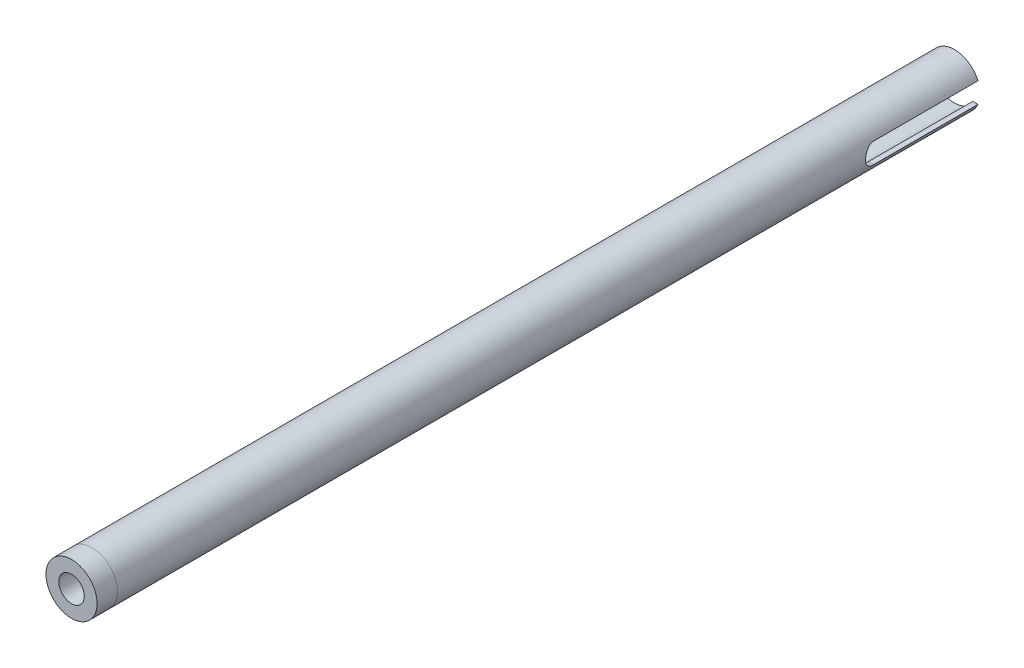
ISO-10303-21;
HEADER;
FILE_DESCRIPTION(('STEP AP214'),'2;1');
FILE_NAME('part.step','',(''),(''),'','','');
FILE_SCHEMA(('AUTOMOTIVE_DESIGN { 1 0 10303 214 1 1 1 1 }'));
ENDSEC;
DATA;
#1=APPLICATION_CONTEXT('core data for automotive mechanical design processes');
#2=APPLICATION_PROTOCOL_DEFINITION('international standard','automotive_design',2000,#1);
#3=PRODUCT_CONTEXT('',#1,'mechanical');
#4=PRODUCT('Part','Part','',(#3));
#5=PRODUCT_RELATED_PRODUCT_CATEGORY('part','',(#4));
#6=PRODUCT_DEFINITION_FORMATION('','',#4);
#7=PRODUCT_DEFINITION_CONTEXT('part definition',#1,'design');
#8=PRODUCT_DEFINITION('design','',#6,#7);
#9=PRODUCT_DEFINITION_SHAPE('','',#8);
#10=(LENGTH_UNIT() NAMED_UNIT(*) SI_UNIT(.MILLI.,.METRE.));
#11=(NAMED_UNIT(*) PLANE_ANGLE_UNIT() SI_UNIT($,.RADIAN.));
#12=(NAMED_UNIT(*) SI_UNIT($,.STERADIAN.) SOLID_ANGLE_UNIT());
#13=UNCERTAINTY_MEASURE_WITH_UNIT(LENGTH_MEASURE(1.E-05),#10,'distance_accuracy_value','');
#14=(GEOMETRIC_REPRESENTATION_CONTEXT(3) GLOBAL_UNCERTAINTY_ASSIGNED_CONTEXT((#13)) GLOBAL_UNIT_ASSIGNED_CONTEXT((#10,
#11,#12)) REPRESENTATION_CONTEXT('',''));
#15=CARTESIAN_POINT('',(0.,0.,0.));
#16=DIRECTION('',(0.,0.,1.));
#17=DIRECTION('',(1.,0.,0.));
#18=AXIS2_PLACEMENT_3D('',#15,#16,#17);
#19=CARTESIAN_POINT('',(0.,0.,-274.208037482782));
#20=DIRECTION('',(0.,0.,1.));
#21=DIRECTION('',(1.,0.,0.));
#22=AXIS2_PLACEMENT_3D('',#19,#20,#21);
#23=CYLINDRICAL_SURFACE('',#22,7.9375);
#24=CARTESIAN_POINT('',(0.,0.,-6.35));
#25=DIRECTION('',(0.,0.,1.));
#26=DIRECTION('',(1.,0.,0.));
#27=AXIS2_PLACEMENT_3D('',#24,#25,#26);
#28=CIRCLE('',#27,7.9375);
#29=CARTESIAN_POINT('',(7.9375,0.,-6.35));
#30=VERTEX_POINT('',#29);
#31=EDGE_CURVE('E167',#30,#30,#28,.T.);
#32=ORIENTED_EDGE('',*,*,#31,.F.);
#33=EDGE_LOOP('',(#32));
#34=FACE_BOUND('',#33,.T.);
#35=CARTESIAN_POINT('',(-7.2748389157424,3.175,-241.823037482782));
#36=CARTESIAN_POINT('',(-7.27482137043434,3.17501267173453,-241.737617367299));
#37=CARTESIAN_POINT('',(-7.27634297592672,3.17155313247793,-241.652206837736));
#38=CARTESIAN_POINT('',(-7.28233338484875,3.15778866907725,-241.482074833408));
#39=CARTESIAN_POINT('',(-7.28680106535325,3.14748635311323,-241.397353108549));
#40=CARTESIAN_POINT('',(-7.29852916312671,3.12019002880163,-241.229539408741));
#41=CARTESIAN_POINT('',(-7.30577831906487,3.10322299732752,-241.146442263981));
#42=CARTESIAN_POINT('',(-7.32282161153745,3.06278779397034,-240.982131161956));
#43=CARTESIAN_POINT('',(-7.33261590324725,3.03931922568673,-240.900917319843));
#44=CARTESIAN_POINT('',(-7.36535331460444,2.9595292434296,-240.66109249726));
#45=CARTESIAN_POINT('',(-7.3916759567784,2.89376893609236,-240.505967568456));
#46=CARTESIAN_POINT('',(-7.45033259991548,2.73920602658921,-240.208880141745));
#47=CARTESIAN_POINT('',(-7.48267254395243,2.65038060922871,-240.066930866527));
#48=CARTESIAN_POINT('',(-7.55175295441386,2.44684429809695,-239.792210097007));
#49=CARTESIAN_POINT('',(-7.58863404630154,2.33103943595689,-239.660282712496));
#50=CARTESIAN_POINT('',(-7.66147718953598,2.07914562663536,-239.417119828864));
#51=CARTESIAN_POINT('',(-7.69743902899202,1.94305205135847,-239.305889063936));
#52=CARTESIAN_POINT('',(-7.76611692840652,1.64778282664418,-239.102967864441));
#53=CARTESIAN_POINT('',(-7.79864638434713,1.48790317306355,-239.012233453037));
#54=CARTESIAN_POINT('',(-7.85502980346525,1.15369615984562,-238.85937589962));
#55=CARTESIAN_POINT('',(-7.87889360585224,0.979385463602713,-238.797220287002));
#56=CARTESIAN_POINT('',(-7.91022225039827,0.670405323433344,-238.716708643346));
#57=CARTESIAN_POINT('',(-7.92038443902171,0.537888188660429,-238.691030719937));
#58=CARTESIAN_POINT('',(-7.93061686811603,0.337231082382099,-238.665275636855));
#59=CARTESIAN_POINT('',(-7.93319257341971,0.269991647180292,-238.658817539574));
#60=CARTESIAN_POINT('',(-7.93663621925193,0.135173873369592,-238.650196521823));
#61=CARTESIAN_POINT('',(-7.93750363389236,0.067595436817584,-238.648034924004));
#62=CARTESIAN_POINT('',(-7.9375,0.,-238.648037482782));
#63=B_SPLINE_CURVE_WITH_KNOTS('',3,(#35,#36,#37,#38,#39,#40,#41,#42,#43,#44,#45,#46,#47,#48,#49,
#50,#51,#52,#53,#54,#55,#56,#57,#58,#59,#60,#61,#62),.UNSPECIFIED.,.F.,.F.,(4,2,2,2,2,2,2,2,2,2,
2,2,2,4),(0.,0.25616079739664,0.512224013007086,0.767261264672294,1.02231406945474,
1.53142416248601,2.041039780479,2.57679273649399,3.11266809162684,3.66991136029743,
4.22651992730647,4.63134321412667,4.83399375866621,5.03670667834028),.UNSPECIFIED.);
#64=CARTESIAN_POINT('',(-7.2748389157424,3.175,-241.823037482782));
#65=VERTEX_POINT('',#64);
#66=CARTESIAN_POINT('',(-7.9375,0.,-238.648037482782));
#67=VERTEX_POINT('',#66);
#68=EDGE_CURVE('E194',#65,#67,#63,.T.);
#69=ORIENTED_EDGE('',*,*,#68,.T.);
#70=CARTESIAN_POINT('',(-7.9375,0.,-238.648037482782));
#71=CARTESIAN_POINT('',(-7.93751279435796,-0.0856973243893161,-238.648025452613));
#72=CARTESIAN_POINT('',(-7.93611246860092,-0.171386675169289,-238.651506820085));
#73=CARTESIAN_POINT('',(-7.93058107051394,-0.342092796869087,-238.665362915419));
#74=CARTESIAN_POINT('',(-7.92645080745519,-0.427109759557717,-238.675735600402));
#75=CARTESIAN_POINT('',(-7.91557399086504,-0.595570690948318,-238.70323279447));
#76=CARTESIAN_POINT('',(-7.90883664469869,-0.679019123580009,-238.720333545743));
#77=CARTESIAN_POINT('',(-7.89293284658536,-0.844038966454647,-238.761100793216));
#78=CARTESIAN_POINT('',(-7.88376629739099,-0.925610301410308,-238.784767552273));
#79=CARTESIAN_POINT('',(-7.8529700783248,-1.16656173687589,-238.865275207971));
#80=CARTESIAN_POINT('',(-7.82802544143957,-1.32244720282991,-238.931667840849));
#81=CARTESIAN_POINT('',(-7.77174407779742,-1.6208190257289,-239.087713244842));
#82=CARTESIAN_POINT('',(-7.74040257287306,-1.76329524966532,-239.177383416905));
#83=CARTESIAN_POINT('',(-7.67287736621953,-2.03755465224645,-239.38183702442));
#84=CARTESIAN_POINT('',(-7.63654472176442,-2.16862853615059,-239.497523881151));
#85=CARTESIAN_POINT('',(-7.56380976030912,-2.41011022612819,-239.748817982861));
#86=CARTESIAN_POINT('',(-7.52740741976911,-2.52050895891189,-239.884433927343));
#87=CARTESIAN_POINT('',(-7.45683282624283,-2.72240939900244,-240.179132422209));
#88=CARTESIAN_POINT('',(-7.42283467350379,-2.81283701743192,-240.338996412125));
#89=CARTESIAN_POINT('',(-7.36333622196319,-2.9651189416839,-240.673122376921));
#90=CARTESIAN_POINT('',(-7.33782422493328,-3.02701262758154,-240.84736411468));
#91=CARTESIAN_POINT('',(-7.30424985403508,-3.10695047193343,-241.155667839331));
#92=CARTESIAN_POINT('',(-7.29331360019112,-3.13238569878911,-241.287526600218));
#93=CARTESIAN_POINT('',(-7.2822797767429,-3.15790858319002,-241.487243481911));
#94=CARTESIAN_POINT('',(-7.27949685702346,-3.16431127275807,-241.554191772671));
#95=CARTESIAN_POINT('',(-7.27577355567174,-3.17285909036155,-241.688433330537));
#96=CARTESIAN_POINT('',(-7.27483380475762,-3.17500276099679,-241.755726707835));
#97=CARTESIAN_POINT('',(-7.2748389157424,-3.175,-241.823037482782));
#98=B_SPLINE_CURVE_WITH_KNOTS('',3,(#70,#71,#72,#73,#74,#75,#76,#77,#78,#79,#80,#81,#82,#83,#84,
#85,#86,#87,#88,#89,#90,#91,#92,#93,#94,#95,#96,#97),.UNSPECIFIED.,.F.,.F.,(4,2,2,2,2,2,2,2,2,2,
2,2,2,4),(0.,0.256996432008006,0.513916713336977,0.769937797705395,1.02596913282158,
1.53722547809955,2.04886511530061,2.58219314099272,3.115754672018,3.67332953074265,
4.23013255190376,4.63306130520187,4.83485003827449,5.03670780985621),.UNSPECIFIED.);
#99=CARTESIAN_POINT('',(-7.2748389157424,-3.175,-241.823037482782));
#100=VERTEX_POINT('',#99);
#101=EDGE_CURVE('E146',#67,#100,#98,.T.);
#102=ORIENTED_EDGE('',*,*,#101,.T.);
#103=DIRECTION('',(0.,0.,-1.));
#104=VECTOR('',#103,1.);
#105=CARTESIAN_POINT('',(-7.2748389157424,-3.175,-238.648037482782));
#106=LINE('',#105,#104);
#107=CARTESIAN_POINT('',(-7.2748389157424,-3.175,-274.208037482782));
#108=VERTEX_POINT('',#107);
#109=EDGE_CURVE('E141',#100,#108,#106,.T.);
#110=ORIENTED_EDGE('',*,*,#109,.T.);
#111=CARTESIAN_POINT('',(0.,0.,-274.208037482782));
#112=DIRECTION('',(0.,0.,1.));
#113=DIRECTION('',(1.,0.,0.));
#114=AXIS2_PLACEMENT_3D('',#111,#112,#113);
#115=CIRCLE('',#114,7.9375);
#116=CARTESIAN_POINT('',(7.2748389157424,-3.175,-274.208037482782));
#117=VERTEX_POINT('',#116);
#118=EDGE_CURVE('E144',#108,#117,#115,.T.);
#119=ORIENTED_EDGE('',*,*,#118,.T.);
#120=DIRECTION('',(0.,0.,-1.));
#121=VECTOR('',#120,1.);
#122=CARTESIAN_POINT('',(7.2748389157424,-3.175,-238.648037482782));
#123=LINE('',#122,#121);
#124=CARTESIAN_POINT('',(7.2748389157424,-3.175,-241.823037482782));
#125=VERTEX_POINT('',#124);
#126=EDGE_CURVE('E427',#125,#117,#123,.T.);
#127=ORIENTED_EDGE('',*,*,#126,.F.);
#128=CARTESIAN_POINT('',(7.2748389157424,-3.175,-241.823037482782));
#129=CARTESIAN_POINT('',(7.27482137043434,-3.17501267173453,-241.737617367299));
#130=CARTESIAN_POINT('',(7.27634297592672,-3.17155313247793,-241.652206837736));
#131=CARTESIAN_POINT('',(7.28233338484875,-3.15778866907725,-241.482074833408));
#132=CARTESIAN_POINT('',(7.28680106535325,-3.14748635311323,-241.397353108549));
#133=CARTESIAN_POINT('',(7.29852916312671,-3.12019002880163,-241.229539408741));
#134=CARTESIAN_POINT('',(7.30577831906487,-3.10322299732752,-241.146442263981));
#135=CARTESIAN_POINT('',(7.32282161153745,-3.06278779397034,-240.982131161956));
#136=CARTESIAN_POINT('',(7.33261590324725,-3.03931922568673,-240.900917319843));
#137=CARTESIAN_POINT('',(7.36535331460444,-2.9595292434296,-240.66109249726));
#138=CARTESIAN_POINT('',(7.3916759567784,-2.89376893609236,-240.505967568456));
#139=CARTESIAN_POINT('',(7.45033259991548,-2.73920602658921,-240.208880141745));
#140=CARTESIAN_POINT('',(7.48267254395243,-2.65038060922871,-240.066930866527));
#141=CARTESIAN_POINT('',(7.55175295441386,-2.44684429809695,-239.792210097007));
#142=CARTESIAN_POINT('',(7.58863404630154,-2.33103943595689,-239.660282712496));
#143=CARTESIAN_POINT('',(7.66147718953598,-2.07914562663536,-239.417119828864));
#144=CARTESIAN_POINT('',(7.69743902899202,-1.94305205135847,-239.305889063936));
#145=CARTESIAN_POINT('',(7.76611692840652,-1.64778282664418,-239.102967864441));
#146=CARTESIAN_POINT('',(7.79864638434713,-1.48790317306355,-239.012233453037));
#147=CARTESIAN_POINT('',(7.85502980346525,-1.15369615984562,-238.85937589962));
#148=CARTESIAN_POINT('',(7.87889360585224,-0.979385463602713,-238.797220287002));
#149=CARTESIAN_POINT('',(7.91022225039827,-0.670405323433344,-238.716708643346));
#150=CARTESIAN_POINT('',(7.92038443902171,-0.537888188660429,-238.691030719937));
#151=CARTESIAN_POINT('',(7.93061686811603,-0.337231082382099,-238.665275636855));
#152=CARTESIAN_POINT('',(7.93319257341971,-0.269991647180292,-238.658817539574));
#153=CARTESIAN_POINT('',(7.93663621925193,-0.135173873369592,-238.650196521823));
#154=CARTESIAN_POINT('',(7.93750363389236,-0.067595436817584,-238.648034924004));
#155=CARTESIAN_POINT('',(7.9375,0.,-238.648037482782));
#156=B_SPLINE_CURVE_WITH_KNOTS('',3,(#128,#129,#130,#131,#132,#133,#134,#135,#136,#137,#138,
#139,#140,#141,#142,#143,#144,#145,#146,#147,#148,#149,#150,#151,#152,#153,#154,#155),
.UNSPECIFIED.,.F.,.F.,(4,2,2,2,2,2,2,2,2,2,2,2,2,4),(0.,0.25616079739664,0.512224013007086,
0.767261264672294,1.02231406945474,1.53142416248601,2.041039780479,2.57679273649399,
3.11266809162684,3.66991136029743,4.22651992730647,4.63134321412667,4.83399375866621,
5.03670667834028),.UNSPECIFIED.);
#157=CARTESIAN_POINT('',(7.9375,0.,-238.648037482782));
#158=VERTEX_POINT('',#157);
#159=EDGE_CURVE('E87',#125,#158,#156,.T.);
#160=ORIENTED_EDGE('',*,*,#159,.T.);
#161=CARTESIAN_POINT('',(7.9375,0.,-238.648037482782));
#162=CARTESIAN_POINT('',(7.93751279435796,0.0856973243893161,-238.648025452613));
#163=CARTESIAN_POINT('',(7.93611246860092,0.171386675169289,-238.651506820085));
#164=CARTESIAN_POINT('',(7.93058107051394,0.342092796869087,-238.665362915419));
#165=CARTESIAN_POINT('',(7.92645080745519,0.427109759557717,-238.675735600402));
#166=CARTESIAN_POINT('',(7.91557399086504,0.595570690948318,-238.70323279447));
#167=CARTESIAN_POINT('',(7.90883664469869,0.679019123580009,-238.720333545743));
#168=CARTESIAN_POINT('',(7.89293284658536,0.844038966454647,-238.761100793216));
#169=CARTESIAN_POINT('',(7.88376629739099,0.925610301410308,-238.784767552273));
#170=CARTESIAN_POINT('',(7.8529700783248,1.16656173687589,-238.865275207971));
#171=CARTESIAN_POINT('',(7.82802544143957,1.32244720282991,-238.931667840849));
#172=CARTESIAN_POINT('',(7.77174407779742,1.6208190257289,-239.087713244842));
#173=CARTESIAN_POINT('',(7.74040257287306,1.76329524966532,-239.177383416905));
#174=CARTESIAN_POINT('',(7.67287736621953,2.03755465224645,-239.38183702442));
#175=CARTESIAN_POINT('',(7.63654472176442,2.16862853615059,-239.497523881151));
#176=CARTESIAN_POINT('',(7.56380976030912,2.41011022612819,-239.748817982861));
#177=CARTESIAN_POINT('',(7.52740741976911,2.52050895891189,-239.884433927343));
#178=CARTESIAN_POINT('',(7.45683282624283,2.72240939900244,-240.179132422209));
#179=CARTESIAN_POINT('',(7.42283467350379,2.81283701743192,-240.338996412125));
#180=CARTESIAN_POINT('',(7.36333622196319,2.9651189416839,-240.673122376921));
#181=CARTESIAN_POINT('',(7.33782422493328,3.02701262758154,-240.84736411468));
#182=CARTESIAN_POINT('',(7.30424985403508,3.10695047193343,-241.155667839331));
#183=CARTESIAN_POINT('',(7.29331360019112,3.13238569878911,-241.287526600218));
#184=CARTESIAN_POINT('',(7.2822797767429,3.15790858319002,-241.487243481911));
#185=CARTESIAN_POINT('',(7.27949685702346,3.16431127275807,-241.554191772671));
#186=CARTESIAN_POINT('',(7.27577355567174,3.17285909036155,-241.688433330537));
#187=CARTESIAN_POINT('',(7.27483380475762,3.17500276099679,-241.755726707835));
#188=CARTESIAN_POINT('',(7.2748389157424,3.175,-241.823037482782));
#189=B_SPLINE_CURVE_WITH_KNOTS('',3,(#161,#162,#163,#164,#165,#166,#167,#168,#169,#170,#171,
#172,#173,#174,#175,#176,#177,#178,#179,#180,#181,#182,#183,#184,#185,#186,#187,#188),
.UNSPECIFIED.,.F.,.F.,(4,2,2,2,2,2,2,2,2,2,2,2,2,4),(0.,0.256996432008006,0.513916713336977,
0.769937797705395,1.02596913282158,1.53722547809955,2.04886511530061,2.58219314099272,
3.115754672018,3.67332953074265,4.23013255190376,4.63306130520187,4.83485003827449,
5.03670780985621),.UNSPECIFIED.);
#190=CARTESIAN_POINT('',(7.2748389157424,3.175,-241.823037482782));
#191=VERTEX_POINT('',#190);
#192=EDGE_CURVE('E73',#158,#191,#189,.T.);
#193=ORIENTED_EDGE('',*,*,#192,.T.);
#194=DIRECTION('',(0.,0.,-1.));
#195=VECTOR('',#194,1.);
#196=CARTESIAN_POINT('',(7.2748389157424,3.175,-238.648037482782));
#197=LINE('',#196,#195);
#198=CARTESIAN_POINT('',(7.2748389157424,3.175,-274.208037482782));
#199=VERTEX_POINT('',#198);
#200=EDGE_CURVE('E160',#191,#199,#197,.T.);
#201=ORIENTED_EDGE('',*,*,#200,.T.);
#202=CARTESIAN_POINT('',(-7.2748389157424,3.175,-274.208037482782));
#203=VERTEX_POINT('',#202);
#204=EDGE_CURVE('E166',#199,#203,#115,.T.);
#205=ORIENTED_EDGE('',*,*,#204,.T.);
#206=DIRECTION('',(0.,0.,-1.));
#207=VECTOR('',#206,1.);
#208=CARTESIAN_POINT('',(-7.2748389157424,3.175,-238.648037482782));
#209=LINE('',#208,#207);
#210=EDGE_CURVE('E420',#65,#203,#209,.T.);
#211=ORIENTED_EDGE('',*,*,#210,.F.);
#212=EDGE_LOOP('',(#69,#102,#110,#119,#127,#160,#193,#201,#205,#211));
#213=FACE_BOUND('',#212,.T.);
#214=ADVANCED_FACE('F63',(#34,#213),#23,.T.);
#215=CARTESIAN_POINT('',(0.,0.,-274.208037482782));
#216=DIRECTION('',(0.,0.,1.));
#217=DIRECTION('',(1.,0.,0.));
#218=AXIS2_PLACEMENT_3D('',#215,#216,#217);
#219=PLANE('',#218);
#220=DIRECTION('',(1.,0.,0.));
#221=VECTOR('',#220,1.);
#222=CARTESIAN_POINT('',(0.,-3.175,-274.208037482782));
#223=LINE('',#222,#221);
#224=CARTESIAN_POINT('',(-5.63085690548073,-3.175,-274.208037482782));
#225=VERTEX_POINT('',#224);
#226=EDGE_CURVE('E153',#108,#225,#223,.T.);
#227=ORIENTED_EDGE('',*,*,#226,.T.);
#228=CARTESIAN_POINT('',(0.,0.,-274.208037482782));
#229=DIRECTION('',(0.,0.,1.));
#230=DIRECTION('',(1.,0.,0.));
#231=AXIS2_PLACEMENT_3D('',#228,#229,#230);
#232=CIRCLE('',#231,6.4643);
#233=CARTESIAN_POINT('',(5.63085690548073,-3.175,-274.208037482782));
#234=VERTEX_POINT('',#233);
#235=EDGE_CURVE('E275',#225,#234,#232,.T.);
#236=ORIENTED_EDGE('',*,*,#235,.T.);
#237=DIRECTION('',(1.,0.,0.));
#238=VECTOR('',#237,1.);
#239=CARTESIAN_POINT('',(0.,-3.175,-274.208037482782));
#240=LINE('',#239,#238);
#241=EDGE_CURVE('E165',#234,#117,#240,.T.);
#242=ORIENTED_EDGE('',*,*,#241,.T.);
#243=ORIENTED_EDGE('',*,*,#118,.F.);
#244=EDGE_LOOP('',(#227,#236,#242,#243));
#245=FACE_BOUND('',#244,.T.);
#246=ADVANCED_FACE('F163',(#245),#219,.F.);
#247=CARTESIAN_POINT('',(0.,0.,-274.208037482782));
#248=DIRECTION('',(0.,0.,1.));
#249=DIRECTION('',(1.,0.,0.));
#250=AXIS2_PLACEMENT_3D('',#247,#248,#249);
#251=CYLINDRICAL_SURFACE('',#250,6.4643);
#252=CARTESIAN_POINT('',(0.,0.,-6.35));
#253=DIRECTION('',(0.,0.,1.));
#254=DIRECTION('',(1.,0.,0.));
#255=AXIS2_PLACEMENT_3D('',#252,#253,#254);
#256=CIRCLE('',#255,6.4643);
#257=CARTESIAN_POINT('',(6.4643,0.,-6.35));
#258=VERTEX_POINT('',#257);
#259=EDGE_CURVE('E149',#258,#258,#256,.T.);
#260=ORIENTED_EDGE('',*,*,#259,.T.);
#261=EDGE_LOOP('',(#260));
#262=FACE_BOUND('',#261,.T.);
#263=DIRECTION('',(0.,0.,-1.));
#264=VECTOR('',#263,1.);
#265=CARTESIAN_POINT('',(-5.63085690548073,-3.175,-238.648037482782));
#266=LINE('',#265,#264);
#267=CARTESIAN_POINT('',(-5.63085690548073,-3.175,-241.823037482782));
#268=VERTEX_POINT('',#267);
#269=EDGE_CURVE('E150',#268,#225,#266,.T.);
#270=ORIENTED_EDGE('',*,*,#269,.F.);
#271=CARTESIAN_POINT('',(-5.63085690548073,-3.175,-241.823037482782));
#272=CARTESIAN_POINT('',(-5.63083313994649,-3.17501475983035,-241.739660648061));
#273=CARTESIAN_POINT('',(-5.63270815771784,-3.17171623434453,-241.656296972892));
#274=CARTESIAN_POINT('',(-5.64007695954704,-3.15860868668088,-241.490291830797));
#275=CARTESIAN_POINT('',(-5.64556860910801,-3.14880350463521,-241.407649966998));
#276=CARTESIAN_POINT('',(-5.6599516035627,-3.12287177657853,-241.244146702327));
#277=CARTESIAN_POINT('',(-5.6688236064135,-3.10678118209034,-241.163277890147));
#278=CARTESIAN_POINT('',(-5.6896425308495,-3.06848763641646,-241.003420510421));
#279=CARTESIAN_POINT('',(-5.70158978762268,-3.04628401892209,-240.92443214886));
#280=CARTESIAN_POINT('',(-5.74141867016874,-2.9709479042579,-240.691373902899));
#281=CARTESIAN_POINT('',(-5.77333273238341,-2.90901346570841,-240.540737362265));
#282=CARTESIAN_POINT('',(-5.84425759514896,-2.76375418819102,-240.251882257431));
#283=CARTESIAN_POINT('',(-5.8832792534464,-2.68039654138928,-240.113683182367));
#284=CARTESIAN_POINT('',(-5.96775435279506,-2.48697819565357,-239.841742144128));
#285=CARTESIAN_POINT('',(-6.01347229172614,-2.37533204038058,-239.709207337779));
#286=CARTESIAN_POINT('',(-6.10404593063631,-2.13182339161096,-239.463831754701));
#287=CARTESIAN_POINT('',(-6.14890136897125,-1.99995486913047,-239.350996872723));
#288=CARTESIAN_POINT('',(-6.23619220514828,-1.70925564842438,-239.141013488803));
#289=CARTESIAN_POINT('',(-6.27828027392068,-1.54922894444791,-239.045363213073));
#290=CARTESIAN_POINT('',(-6.35178949400201,-1.21302302470907,-238.882979307857));
#291=CARTESIAN_POINT('',(-6.3832266631188,-1.03686857473501,-238.816202214052));
#292=CARTESIAN_POINT('',(-6.42590822780063,-0.717171909263562,-238.726769566744));
#293=CARTESIAN_POINT('',(-6.4401838278065,-0.575906031157518,-238.697381321822));
#294=CARTESIAN_POINT('',(-6.45458743188517,-0.361448476439089,-238.66784860216));
#295=CARTESIAN_POINT('',(-6.45822048728408,-0.289432204318641,-238.660429157399));
#296=CARTESIAN_POINT('',(-6.46308007773031,-0.144952050292009,-238.650520685239));
#297=CARTESIAN_POINT('',(-6.46430565210199,-0.0724880012714801,-238.648033626044));
#298=CARTESIAN_POINT('',(-6.4643,0.,-238.648037482782));
#299=B_SPLINE_CURVE_WITH_KNOTS('',3,(#271,#272,#273,#274,#275,#276,#277,#278,#279,#280,#281,
#282,#283,#284,#285,#286,#287,#288,#289,#290,#291,#292,#293,#294,#295,#296,#297,#298),
.UNSPECIFIED.,.F.,.F.,(4,2,2,2,2,2,2,2,2,2,2,2,2,4),(0.,0.250022608278582,0.499897788004003,
0.748364171658968,0.996857648438737,1.4924174038968,1.98874063697387,2.52413245916955,
3.05968421153495,3.63008006190819,4.19961425046546,4.63293550793414,4.85021333970387,
5.0675778559182),.UNSPECIFIED.);
#300=CARTESIAN_POINT('',(-6.4643,0.,-238.648037482782));
#301=VERTEX_POINT('',#300);
#302=EDGE_CURVE('E221',#268,#301,#299,.T.);
#303=ORIENTED_EDGE('',*,*,#302,.T.);
#304=CARTESIAN_POINT('',(-6.4643,0.,-238.648037482782));
#305=CARTESIAN_POINT('',(-6.46431471784482,0.08399476434355,-238.648024138655));
#306=CARTESIAN_POINT('',(-6.46266329267846,0.167980128010396,-238.651370238024));
#307=CARTESIAN_POINT('',(-6.45613851930725,0.335267070847881,-238.664677691628));
#308=CARTESIAN_POINT('',(-6.45126643524264,0.418568905327643,-238.674636450336));
#309=CARTESIAN_POINT('',(-6.4384393661228,0.583520093709587,-238.701006492804));
#310=CARTESIAN_POINT('',(-6.43049830091841,0.665175181914785,-238.717388647052));
#311=CARTESIAN_POINT('',(-6.41174605062734,0.826621713408843,-238.756406186806));
#312=CARTESIAN_POINT('',(-6.40093469346324,0.906413044651111,-238.779041947226));
#313=CARTESIAN_POINT('',(-6.3645999533627,1.14200454475576,-238.855941511319));
#314=CARTESIAN_POINT('',(-6.33514826225986,1.29435730209625,-238.919252144502));
#315=CARTESIAN_POINT('',(-6.26847721301058,1.5861501237047,-239.067743644332));
#316=CARTESIAN_POINT('',(-6.23125016174678,1.7255772002446,-239.152946190697));
#317=CARTESIAN_POINT('',(-6.14993667819984,1.99664965861336,-239.348460136827));
#318=CARTESIAN_POINT('',(-6.10557667432164,2.12736555519218,-239.459946996477));
#319=CARTESIAN_POINT('',(-6.01591119010693,2.36910305567939,-239.702349419659));
#320=CARTESIAN_POINT('',(-5.97060501254447,2.4801095192896,-239.833279778646));
#321=CARTESIAN_POINT('',(-5.88028635793905,2.68759195973766,-240.122602117388));
#322=CARTESIAN_POINT('',(-5.83554983812279,2.78235777578918,-240.282316220041));
#323=CARTESIAN_POINT('',(-5.75613746809778,2.94315382396594,-240.617667464617));
#324=CARTESIAN_POINT('',(-5.72144095718824,3.00924320962385,-240.793270916471));
#325=CARTESIAN_POINT('',(-5.67404956693615,3.09744900867388,-241.111275218158));
#326=CARTESIAN_POINT('',(-5.65804978215016,3.12636521602239,-241.251299908099));
#327=CARTESIAN_POINT('',(-5.64184153899281,3.15545749985709,-241.46404820671));
#328=CARTESIAN_POINT('',(-5.63773701667688,3.16277482388528,-241.535558094814));
#329=CARTESIAN_POINT('',(-5.63223913004552,3.17254960488947,-241.679049156585));
#330=CARTESIAN_POINT('',(-5.6308471601211,3.17500456237039,-241.751030553567));
#331=CARTESIAN_POINT('',(-5.63085690548073,3.175,-241.823037482782));
#332=B_SPLINE_CURVE_WITH_KNOTS('',3,(#304,#305,#306,#307,#308,#309,#310,#311,#312,#313,#314,
#315,#316,#317,#318,#319,#320,#321,#322,#323,#324,#325,#326,#327,#328,#329,#330,#331),
.UNSPECIFIED.,.F.,.F.,(4,2,2,2,2,2,2,2,2,2,2,2,2,4),(0.,0.251885801688014,0.503672794384371,
0.754330922106983,1.00500408047847,1.5053414676088,2.00617626510685,2.53624961383847,
3.06672840649525,3.63692439554961,4.20593853113135,4.63586569132643,4.85167139809471,
5.06758801082733),.UNSPECIFIED.);
#333=CARTESIAN_POINT('',(-5.63085690548073,3.175,-241.823037482782));
#334=VERTEX_POINT('',#333);
#335=EDGE_CURVE('E186',#301,#334,#332,.T.);
#336=ORIENTED_EDGE('',*,*,#335,.T.);
#337=DIRECTION('',(0.,0.,-1.));
#338=VECTOR('',#337,1.);
#339=CARTESIAN_POINT('',(-5.63085690548073,3.175,-238.648037482782));
#340=LINE('',#339,#338);
#341=CARTESIAN_POINT('',(-5.63085690548073,3.175,-274.208037482782));
#342=VERTEX_POINT('',#341);
#343=EDGE_CURVE('E417',#334,#342,#340,.T.);
#344=ORIENTED_EDGE('',*,*,#343,.T.);
#345=CARTESIAN_POINT('',(5.63085690548073,3.175,-274.208037482782));
#346=VERTEX_POINT('',#345);
#347=EDGE_CURVE('E172',#346,#342,#232,.T.);
#348=ORIENTED_EDGE('',*,*,#347,.F.);
#349=DIRECTION('',(0.,0.,-1.));
#350=VECTOR('',#349,1.);
#351=CARTESIAN_POINT('',(5.63085690548073,3.175,-238.648037482782));
#352=LINE('',#351,#350);
#353=CARTESIAN_POINT('',(5.63085690548073,3.175,-241.823037482782));
#354=VERTEX_POINT('',#353);
#355=EDGE_CURVE('E269',#354,#346,#352,.T.);
#356=ORIENTED_EDGE('',*,*,#355,.F.);
#357=CARTESIAN_POINT('',(5.63085690548073,3.175,-241.823037482782));
#358=CARTESIAN_POINT('',(5.63083313994649,3.17501475983035,-241.739660648061));
#359=CARTESIAN_POINT('',(5.63270815771784,3.17171623434453,-241.656296972892));
#360=CARTESIAN_POINT('',(5.64007695954704,3.15860868668088,-241.490291830797));
#361=CARTESIAN_POINT('',(5.64556860910801,3.14880350463521,-241.407649966998));
#362=CARTESIAN_POINT('',(5.6599516035627,3.12287177657853,-241.244146702327));
#363=CARTESIAN_POINT('',(5.6688236064135,3.10678118209034,-241.163277890147));
#364=CARTESIAN_POINT('',(5.6896425308495,3.06848763641646,-241.003420510421));
#365=CARTESIAN_POINT('',(5.70158978762268,3.04628401892209,-240.92443214886));
#366=CARTESIAN_POINT('',(5.74141867016874,2.9709479042579,-240.691373902899));
#367=CARTESIAN_POINT('',(5.77333273238341,2.90901346570841,-240.540737362265));
#368=CARTESIAN_POINT('',(5.84425759514896,2.76375418819102,-240.251882257431));
#369=CARTESIAN_POINT('',(5.8832792534464,2.68039654138928,-240.113683182367));
#370=CARTESIAN_POINT('',(5.96775435279506,2.48697819565357,-239.841742144128));
#371=CARTESIAN_POINT('',(6.01347229172614,2.37533204038058,-239.709207337779));
#372=CARTESIAN_POINT('',(6.10404593063631,2.13182339161096,-239.463831754701));
#373=CARTESIAN_POINT('',(6.14890136897125,1.99995486913047,-239.350996872723));
#374=CARTESIAN_POINT('',(6.23619220514828,1.70925564842438,-239.141013488803));
#375=CARTESIAN_POINT('',(6.27828027392068,1.54922894444791,-239.045363213073));
#376=CARTESIAN_POINT('',(6.35178949400201,1.21302302470907,-238.882979307857));
#377=CARTESIAN_POINT('',(6.3832266631188,1.03686857473501,-238.816202214052));
#378=CARTESIAN_POINT('',(6.42590822780063,0.717171909263562,-238.726769566744));
#379=CARTESIAN_POINT('',(6.4401838278065,0.575906031157518,-238.697381321822));
#380=CARTESIAN_POINT('',(6.45458743188517,0.361448476439089,-238.66784860216));
#381=CARTESIAN_POINT('',(6.45822048728408,0.289432204318641,-238.660429157399));
#382=CARTESIAN_POINT('',(6.46308007773031,0.144952050292009,-238.650520685239));
#383=CARTESIAN_POINT('',(6.46430565210199,0.0724880012714801,-238.648033626044));
#384=CARTESIAN_POINT('',(6.4643,0.,-238.648037482782));
#385=B_SPLINE_CURVE_WITH_KNOTS('',3,(#357,#358,#359,#360,#361,#362,#363,#364,#365,#366,#367,
#368,#369,#370,#371,#372,#373,#374,#375,#376,#377,#378,#379,#380,#381,#382,#383,#384),
.UNSPECIFIED.,.F.,.F.,(4,2,2,2,2,2,2,2,2,2,2,2,2,4),(0.,0.250022608278582,0.499897788004003,
0.748364171658968,0.996857648438737,1.4924174038968,1.98874063697387,2.52413245916955,
3.05968421153495,3.63008006190819,4.19961425046546,4.63293550793414,4.85021333970387,
5.0675778559182),.UNSPECIFIED.);
#386=CARTESIAN_POINT('',(6.4643,0.,-238.648037482782));
#387=VERTEX_POINT('',#386);
#388=EDGE_CURVE('E13',#354,#387,#385,.T.);
#389=ORIENTED_EDGE('',*,*,#388,.T.);
#390=CARTESIAN_POINT('',(6.4643,0.,-238.648037482782));
#391=CARTESIAN_POINT('',(6.46431471784482,-0.08399476434355,-238.648024138655));
#392=CARTESIAN_POINT('',(6.46266329267846,-0.167980128010396,-238.651370238024));
#393=CARTESIAN_POINT('',(6.45613851930725,-0.335267070847881,-238.664677691628));
#394=CARTESIAN_POINT('',(6.45126643524264,-0.418568905327643,-238.674636450336));
#395=CARTESIAN_POINT('',(6.4384393661228,-0.583520093709587,-238.701006492804));
#396=CARTESIAN_POINT('',(6.43049830091841,-0.665175181914785,-238.717388647052));
#397=CARTESIAN_POINT('',(6.41174605062734,-0.826621713408843,-238.756406186806));
#398=CARTESIAN_POINT('',(6.40093469346324,-0.906413044651111,-238.779041947226));
#399=CARTESIAN_POINT('',(6.3645999533627,-1.14200454475576,-238.855941511319));
#400=CARTESIAN_POINT('',(6.33514826225986,-1.29435730209625,-238.919252144502));
#401=CARTESIAN_POINT('',(6.26847721301058,-1.5861501237047,-239.067743644332));
#402=CARTESIAN_POINT('',(6.23125016174678,-1.7255772002446,-239.152946190697));
#403=CARTESIAN_POINT('',(6.14993667819984,-1.99664965861336,-239.348460136827));
#404=CARTESIAN_POINT('',(6.10557667432164,-2.12736555519218,-239.459946996477));
#405=CARTESIAN_POINT('',(6.01591119010693,-2.36910305567939,-239.702349419659));
#406=CARTESIAN_POINT('',(5.97060501254447,-2.4801095192896,-239.833279778646));
#407=CARTESIAN_POINT('',(5.88028635793905,-2.68759195973766,-240.122602117388));
#408=CARTESIAN_POINT('',(5.83554983812279,-2.78235777578918,-240.282316220041));
#409=CARTESIAN_POINT('',(5.75613746809778,-2.94315382396594,-240.617667464617));
#410=CARTESIAN_POINT('',(5.72144095718824,-3.00924320962385,-240.793270916471));
#411=CARTESIAN_POINT('',(5.67404956693615,-3.09744900867388,-241.111275218158));
#412=CARTESIAN_POINT('',(5.65804978215016,-3.12636521602239,-241.251299908099));
#413=CARTESIAN_POINT('',(5.64184153899281,-3.15545749985709,-241.46404820671));
#414=CARTESIAN_POINT('',(5.63773701667688,-3.16277482388528,-241.535558094814));
#415=CARTESIAN_POINT('',(5.63223913004552,-3.17254960488947,-241.679049156585));
#416=CARTESIAN_POINT('',(5.6308471601211,-3.17500456237039,-241.751030553567));
#417=CARTESIAN_POINT('',(5.63085690548073,-3.175,-241.823037482782));
#418=B_SPLINE_CURVE_WITH_KNOTS('',3,(#390,#391,#392,#393,#394,#395,#396,#397,#398,#399,#400,
#401,#402,#403,#404,#405,#406,#407,#408,#409,#410,#411,#412,#413,#414,#415,#416,#417),
.UNSPECIFIED.,.F.,.F.,(4,2,2,2,2,2,2,2,2,2,2,2,2,4),(0.,0.251885801688014,0.503672794384371,
0.754330922106983,1.00500408047847,1.5053414676088,2.00617626510685,2.53624961383847,
3.06672840649525,3.63692439554961,4.20593853113135,4.63586569132643,4.85167139809471,
5.06758801082733),.UNSPECIFIED.);
#419=CARTESIAN_POINT('',(5.63085690548073,-3.175,-241.823037482782));
#420=VERTEX_POINT('',#419);
#421=EDGE_CURVE('E237',#387,#420,#418,.T.);
#422=ORIENTED_EDGE('',*,*,#421,.T.);
#423=DIRECTION('',(0.,0.,-1.));
#424=VECTOR('',#423,1.);
#425=CARTESIAN_POINT('',(5.63085690548073,-3.175,-238.648037482782));
#426=LINE('',#425,#424);
#427=EDGE_CURVE('E271',#420,#234,#426,.T.);
#428=ORIENTED_EDGE('',*,*,#427,.T.);
#429=ORIENTED_EDGE('',*,*,#235,.F.);
#430=EDGE_LOOP('',(#270,#303,#336,#344,#348,#356,#389,#422,#428,#429));
#431=FACE_BOUND('',#430,.T.);
#432=ADVANCED_FACE('F201',(#262,#431),#251,.F.);
#433=ORIENTED_EDGE('',*,*,#347,.T.);
#434=DIRECTION('',(1.,0.,0.));
#435=VECTOR('',#434,1.);
#436=CARTESIAN_POINT('',(0.,3.175,-274.208037482782));
#437=LINE('',#436,#435);
#438=EDGE_CURVE('E159',#203,#342,#437,.T.);
#439=ORIENTED_EDGE('',*,*,#438,.F.);
#440=ORIENTED_EDGE('',*,*,#204,.F.);
#441=DIRECTION('',(1.,0.,0.));
#442=VECTOR('',#441,1.);
#443=CARTESIAN_POINT('',(0.,3.175,-274.208037482782));
#444=LINE('',#443,#442);
#445=EDGE_CURVE('E253',#346,#199,#444,.T.);
#446=ORIENTED_EDGE('',*,*,#445,.F.);
#447=EDGE_LOOP('',(#433,#439,#440,#446));
#448=FACE_BOUND('',#447,.T.);
#449=ADVANCED_FACE('F286',(#448),#219,.F.);
#450=CARTESIAN_POINT('',(0.,0.,-6.35));
#451=DIRECTION('',(0.,0.,1.));
#452=DIRECTION('',(1.,0.,0.));
#453=AXIS2_PLACEMENT_3D('',#450,#451,#452);
#454=PLANE('',#453);
#455=ORIENTED_EDGE('',*,*,#259,.F.);
#456=EDGE_LOOP('',(#455));
#457=FACE_BOUND('',#456,.T.);
#458=ORIENTED_EDGE('',*,*,#31,.T.);
#459=EDGE_LOOP('',(#458));
#460=FACE_BOUND('',#459,.T.);
#461=ADVANCED_FACE('F283',(#457,#460),#454,.T.);
#462=CARTESIAN_POINT('',(0.,3.175,-238.648037482782));
#463=DIRECTION('',(0.,1.,0.));
#464=DIRECTION('',(0.,0.,1.));
#465=AXIS2_PLACEMENT_3D('',#462,#463,#464);
#466=PLANE('',#465);
#467=ORIENTED_EDGE('',*,*,#200,.F.);
#468=DIRECTION('',(1.,0.,0.));
#469=VECTOR('',#468,1.);
#470=CARTESIAN_POINT('',(5.63085690548073,3.175,-241.823037482782));
#471=LINE('',#470,#469);
#472=EDGE_CURVE('E184',#191,#354,#471,.F.);
#473=ORIENTED_EDGE('',*,*,#472,.T.);
#474=ORIENTED_EDGE('',*,*,#355,.T.);
#475=ORIENTED_EDGE('',*,*,#445,.T.);
#476=EDGE_LOOP('',(#467,#473,#474,#475));
#477=FACE_BOUND('',#476,.T.);
#478=ADVANCED_FACE('F266',(#477),#466,.F.);
#479=CARTESIAN_POINT('',(0.,-3.175,-238.648037482782));
#480=DIRECTION('',(0.,1.,0.));
#481=DIRECTION('',(0.,0.,1.));
#482=AXIS2_PLACEMENT_3D('',#479,#480,#481);
#483=PLANE('',#482);
#484=ORIENTED_EDGE('',*,*,#427,.F.);
#485=DIRECTION('',(1.,0.,0.));
#486=VECTOR('',#485,1.);
#487=CARTESIAN_POINT('',(0.,-3.175,-241.823037482782));
#488=LINE('',#487,#486);
#489=EDGE_CURVE('E181',#420,#125,#488,.T.);
#490=ORIENTED_EDGE('',*,*,#489,.T.);
#491=ORIENTED_EDGE('',*,*,#126,.T.);
#492=ORIENTED_EDGE('',*,*,#241,.F.);
#493=EDGE_LOOP('',(#484,#490,#491,#492));
#494=FACE_BOUND('',#493,.T.);
#495=ADVANCED_FACE('F361',(#494),#483,.T.);
#496=CARTESIAN_POINT('',(0.,-3.175,-238.648037482782));
#497=DIRECTION('',(0.,1.,0.));
#498=DIRECTION('',(0.,0.,1.));
#499=AXIS2_PLACEMENT_3D('',#496,#497,#498);
#500=PLANE('',#499);
#501=ORIENTED_EDGE('',*,*,#109,.F.);
#502=DIRECTION('',(1.,0.,0.));
#503=VECTOR('',#502,1.);
#504=CARTESIAN_POINT('',(0.,-3.175,-241.823037482782));
#505=LINE('',#504,#503);
#506=EDGE_CURVE('E179',#100,#268,#505,.T.);
#507=ORIENTED_EDGE('',*,*,#506,.T.);
#508=ORIENTED_EDGE('',*,*,#269,.T.);
#509=ORIENTED_EDGE('',*,*,#226,.F.);
#510=EDGE_LOOP('',(#501,#507,#508,#509));
#511=FACE_BOUND('',#510,.T.);
#512=ADVANCED_FACE('F154',(#511),#500,.T.);
#513=CARTESIAN_POINT('',(0.,3.175,-238.648037482782));
#514=DIRECTION('',(0.,1.,0.));
#515=DIRECTION('',(0.,0.,1.));
#516=AXIS2_PLACEMENT_3D('',#513,#514,#515);
#517=PLANE('',#516);
#518=ORIENTED_EDGE('',*,*,#343,.F.);
#519=DIRECTION('',(1.,0.,0.));
#520=VECTOR('',#519,1.);
#521=CARTESIAN_POINT('',(-7.2748389157424,3.175,-241.823037482782));
#522=LINE('',#521,#520);
#523=EDGE_CURVE('E170',#334,#65,#522,.F.);
#524=ORIENTED_EDGE('',*,*,#523,.T.);
#525=ORIENTED_EDGE('',*,*,#210,.T.);
#526=ORIENTED_EDGE('',*,*,#438,.T.);
#527=EDGE_LOOP('',(#518,#524,#525,#526));
#528=FACE_BOUND('',#527,.T.);
#529=ADVANCED_FACE('F216',(#528),#517,.F.);
#530=CARTESIAN_POINT('',(0.,0.,-241.823037482782));
#531=DIRECTION('',(1.,0.,0.));
#532=DIRECTION('',(0.,0.,-1.));
#533=AXIS2_PLACEMENT_3D('',#530,#531,#532);
#534=CYLINDRICAL_SURFACE('',#533,3.175);
#535=ORIENTED_EDGE('',*,*,#506,.F.);
#536=ORIENTED_EDGE('',*,*,#101,.F.);
#537=DIRECTION('',(1.,0.,0.));
#538=VECTOR('',#537,1.);
#539=CARTESIAN_POINT('',(0.,0.,-238.648037482782));
#540=LINE('',#539,#538);
#541=EDGE_CURVE('E251',#301,#67,#540,.F.);
#542=ORIENTED_EDGE('',*,*,#541,.F.);
#543=ORIENTED_EDGE('',*,*,#302,.F.);
#544=EDGE_LOOP('',(#535,#536,#542,#543));
#545=FACE_BOUND('',#544,.T.);
#546=ADVANCED_FACE('F209',(#545),#534,.F.);
#547=CARTESIAN_POINT('',(0.,0.,-241.823037482782));
#548=DIRECTION('',(-1.,0.,0.));
#549=DIRECTION('',(0.,0.,1.));
#550=AXIS2_PLACEMENT_3D('',#547,#548,#549);
#551=CYLINDRICAL_SURFACE('',#550,3.175);
#552=ORIENTED_EDGE('',*,*,#68,.F.);
#553=ORIENTED_EDGE('',*,*,#523,.F.);
#554=ORIENTED_EDGE('',*,*,#335,.F.);
#555=ORIENTED_EDGE('',*,*,#541,.T.);
#556=EDGE_LOOP('',(#552,#553,#554,#555));
#557=FACE_BOUND('',#556,.T.);
#558=ADVANCED_FACE('F205',(#557),#551,.F.);
#559=CARTESIAN_POINT('',(0.,0.,-241.823037482782));
#560=DIRECTION('',(-1.,0.,0.));
#561=DIRECTION('',(0.,0.,1.));
#562=AXIS2_PLACEMENT_3D('',#559,#560,#561);
#563=CYLINDRICAL_SURFACE('',#562,3.175);
#564=DIRECTION('',(1.,0.,0.));
#565=VECTOR('',#564,1.);
#566=CARTESIAN_POINT('',(7.2748389157424,0.,-238.648037482782));
#567=LINE('',#566,#565);
#568=EDGE_CURVE('E68',#387,#158,#567,.T.);
#569=ORIENTED_EDGE('',*,*,#568,.F.);
#570=ORIENTED_EDGE('',*,*,#388,.F.);
#571=ORIENTED_EDGE('',*,*,#472,.F.);
#572=ORIENTED_EDGE('',*,*,#192,.F.);
#573=EDGE_LOOP('',(#569,#570,#571,#572));
#574=FACE_BOUND('',#573,.T.);
#575=ADVANCED_FACE('F65',(#574),#563,.F.);
#576=CARTESIAN_POINT('',(0.,0.,-241.823037482782));
#577=DIRECTION('',(1.,0.,0.));
#578=DIRECTION('',(0.,0.,-1.));
#579=AXIS2_PLACEMENT_3D('',#576,#577,#578);
#580=CYLINDRICAL_SURFACE('',#579,3.175);
#581=ORIENTED_EDGE('',*,*,#421,.F.);
#582=ORIENTED_EDGE('',*,*,#568,.T.);
#583=ORIENTED_EDGE('',*,*,#159,.F.);
#584=ORIENTED_EDGE('',*,*,#489,.F.);
#585=EDGE_LOOP('',(#581,#582,#583,#584));
#586=FACE_BOUND('',#585,.T.);
#587=ADVANCED_FACE('F218',(#586),#580,.F.);
#588=CLOSED_SHELL('',(#214,#246,#432,#449,#461,#478,#495,#512,#529,#546,#558,#575,#587));
#589=MANIFOLD_SOLID_BREP('B2',#588);
#590=CARTESIAN_POINT('',(0.,0.,-6.35));
#591=DIRECTION('',(0.,0.,1.));
#592=DIRECTION('',(1.,0.,0.));
#593=AXIS2_PLACEMENT_3D('',#590,#591,#592);
#594=CYLINDRICAL_SURFACE('',#593,7.9375);
#595=CARTESIAN_POINT('',(0.,0.,-6.35));
#596=DIRECTION('',(0.,0.,1.));
#597=DIRECTION('',(1.,0.,0.));
#598=AXIS2_PLACEMENT_3D('',#595,#596,#597);
#599=CIRCLE('',#598,7.9375);
#600=CARTESIAN_POINT('',(7.9375,0.,-6.35));
#601=VERTEX_POINT('',#600);
#602=EDGE_CURVE('E62',#601,#601,#599,.T.);
#603=ORIENTED_EDGE('',*,*,#602,.T.);
#604=EDGE_LOOP('',(#603));
#605=FACE_BOUND('',#604,.T.);
#606=CARTESIAN_POINT('',(0.,0.,0.));
#607=DIRECTION('',(0.,0.,1.));
#608=DIRECTION('',(1.,0.,0.));
#609=AXIS2_PLACEMENT_3D('',#606,#607,#608);
#610=CIRCLE('',#609,7.9375);
#611=CARTESIAN_POINT('',(7.9375,0.,0.));
#612=VERTEX_POINT('',#611);
#613=EDGE_CURVE('E465',#612,#612,#610,.T.);
#614=ORIENTED_EDGE('',*,*,#613,.F.);
#615=EDGE_LOOP('',(#614));
#616=FACE_BOUND('',#615,.T.);
#617=ADVANCED_FACE('F454',(#605,#616),#594,.T.);
#618=CARTESIAN_POINT('',(0.,0.,-6.35));
#619=DIRECTION('',(0.,0.,1.));
#620=DIRECTION('',(1.,0.,0.));
#621=AXIS2_PLACEMENT_3D('',#618,#619,#620);
#622=CYLINDRICAL_SURFACE('',#621,3.96875);
#623=CARTESIAN_POINT('',(0.,0.,0.));
#624=DIRECTION('',(0.,0.,1.));
#625=DIRECTION('',(1.,0.,0.));
#626=AXIS2_PLACEMENT_3D('',#623,#624,#625);
#627=CIRCLE('',#626,3.96875);
#628=CARTESIAN_POINT('',(3.96875,0.,0.));
#629=VERTEX_POINT('',#628);
#630=EDGE_CURVE('E457',#629,#629,#627,.T.);
#631=ORIENTED_EDGE('',*,*,#630,.T.);
#632=EDGE_LOOP('',(#631));
#633=FACE_BOUND('',#632,.T.);
#634=CARTESIAN_POINT('',(0.,0.,-15.875));
#635=DIRECTION('',(0.,0.,1.));
#636=DIRECTION('',(1.,0.,0.));
#637=AXIS2_PLACEMENT_3D('',#634,#635,#636);
#638=CIRCLE('',#637,3.96875);
#639=CARTESIAN_POINT('',(3.96875,0.,-15.875));
#640=VERTEX_POINT('',#639);
#641=EDGE_CURVE('E477',#640,#640,#638,.T.);
#642=ORIENTED_EDGE('',*,*,#641,.F.);
#643=EDGE_LOOP('',(#642));
#644=FACE_BOUND('',#643,.T.);
#645=ADVANCED_FACE('F485',(#633,#644),#622,.F.);
#646=CARTESIAN_POINT('',(0.,0.,-6.35));
#647=DIRECTION('',(0.,0.,1.));
#648=DIRECTION('',(1.,0.,0.));
#649=AXIS2_PLACEMENT_3D('',#646,#647,#648);
#650=PLANE('',#649);
#651=CARTESIAN_POINT('',(0.,0.,-6.35));
#652=DIRECTION('',(0.,0.,1.));
#653=DIRECTION('',(1.,0.,0.));
#654=AXIS2_PLACEMENT_3D('',#651,#652,#653);
#655=CIRCLE('',#654,6.4643);
#656=CARTESIAN_POINT('',(6.4643,0.,-6.35));
#657=VERTEX_POINT('',#656);
#658=EDGE_CURVE('E467',#657,#657,#655,.T.);
#659=ORIENTED_EDGE('',*,*,#658,.T.);
#660=EDGE_LOOP('',(#659));
#661=FACE_BOUND('',#660,.T.);
#662=ORIENTED_EDGE('',*,*,#602,.F.);
#663=EDGE_LOOP('',(#662));
#664=FACE_BOUND('',#663,.T.);
#665=ADVANCED_FACE('F487',(#661,#664),#650,.F.);
#666=CARTESIAN_POINT('',(0.,0.,0.));
#667=DIRECTION('',(0.,0.,1.));
#668=DIRECTION('',(1.,0.,0.));
#669=AXIS2_PLACEMENT_3D('',#666,#667,#668);
#670=PLANE('',#669);
#671=ORIENTED_EDGE('',*,*,#613,.T.);
#672=EDGE_LOOP('',(#671));
#673=FACE_BOUND('',#672,.T.);
#674=ORIENTED_EDGE('',*,*,#630,.F.);
#675=EDGE_LOOP('',(#674));
#676=FACE_BOUND('',#675,.T.);
#677=ADVANCED_FACE('F493',(#673,#676),#670,.T.);
#678=CARTESIAN_POINT('',(0.,0.,-15.875));
#679=DIRECTION('',(0.,0.,1.));
#680=DIRECTION('',(1.,0.,0.));
#681=AXIS2_PLACEMENT_3D('',#678,#679,#680);
#682=CYLINDRICAL_SURFACE('',#681,6.4643);
#683=CARTESIAN_POINT('',(0.,0.,-15.875));
#684=DIRECTION('',(0.,0.,1.));
#685=DIRECTION('',(1.,0.,0.));
#686=AXIS2_PLACEMENT_3D('',#683,#684,#685);
#687=CIRCLE('',#686,6.4643);
#688=CARTESIAN_POINT('',(6.4643,0.,-15.875));
#689=VERTEX_POINT('',#688);
#690=EDGE_CURVE('E470',#689,#689,#687,.T.);
#691=CARTESIAN_POINT('',(6.4643,0.,-15.875));
#692=CARTESIAN_POINT('',(6.4643,0.,-15.77578125));
#693=CARTESIAN_POINT('',(6.4643,0.,-15.6765625));
#694=CARTESIAN_POINT('',(6.4643,0.,-15.478125));
#695=CARTESIAN_POINT('',(6.4643,0.,-15.37890625));
#696=CARTESIAN_POINT('',(6.4643,0.,-15.18046875));
#697=CARTESIAN_POINT('',(6.4643,0.,-15.08125));
#698=CARTESIAN_POINT('',(6.4643,0.,-14.8828125));
#699=CARTESIAN_POINT('',(6.4643,0.,-14.78359375));
#700=CARTESIAN_POINT('',(6.4643,0.,-14.58515625));
#701=CARTESIAN_POINT('',(6.4643,0.,-14.4859375));
#702=CARTESIAN_POINT('',(6.4643,0.,-14.2875));
#703=CARTESIAN_POINT('',(6.4643,0.,-14.18828125));
#704=CARTESIAN_POINT('',(6.4643,0.,-13.98984375));
#705=CARTESIAN_POINT('',(6.4643,0.,-13.890625));
#706=CARTESIAN_POINT('',(6.4643,0.,-13.6921875));
#707=CARTESIAN_POINT('',(6.4643,0.,-13.59296875));
#708=CARTESIAN_POINT('',(6.4643,0.,-13.39453125));
#709=CARTESIAN_POINT('',(6.4643,0.,-13.2953125));
#710=CARTESIAN_POINT('',(6.4643,0.,-13.096875));
#711=CARTESIAN_POINT('',(6.4643,0.,-12.99765625));
#712=CARTESIAN_POINT('',(6.4643,0.,-12.79921875));
#713=CARTESIAN_POINT('',(6.4643,0.,-12.7));
#714=CARTESIAN_POINT('',(6.4643,0.,-12.5015625));
#715=CARTESIAN_POINT('',(6.4643,0.,-12.40234375));
#716=CARTESIAN_POINT('',(6.4643,0.,-12.20390625));
#717=CARTESIAN_POINT('',(6.4643,0.,-12.1046875));
#718=CARTESIAN_POINT('',(6.4643,0.,-11.90625));
#719=CARTESIAN_POINT('',(6.4643,0.,-11.80703125));
#720=CARTESIAN_POINT('',(6.4643,0.,-11.60859375));
#721=CARTESIAN_POINT('',(6.4643,0.,-11.509375));
#722=CARTESIAN_POINT('',(6.4643,0.,-11.3109375));
#723=CARTESIAN_POINT('',(6.4643,0.,-11.21171875));
#724=CARTESIAN_POINT('',(6.4643,0.,-11.01328125));
#725=CARTESIAN_POINT('',(6.4643,0.,-10.9140625));
#726=CARTESIAN_POINT('',(6.4643,0.,-10.715625));
#727=CARTESIAN_POINT('',(6.4643,0.,-10.61640625));
#728=CARTESIAN_POINT('',(6.4643,0.,-10.41796875));
#729=CARTESIAN_POINT('',(6.4643,0.,-10.31875));
#730=CARTESIAN_POINT('',(6.4643,0.,-10.1203125));
#731=CARTESIAN_POINT('',(6.4643,0.,-10.02109375));
#732=CARTESIAN_POINT('',(6.4643,0.,-9.82265625));
#733=CARTESIAN_POINT('',(6.4643,0.,-9.7234375));
#734=CARTESIAN_POINT('',(6.4643,0.,-9.525));
#735=CARTESIAN_POINT('',(6.4643,0.,-9.42578125));
#736=CARTESIAN_POINT('',(6.4643,0.,-9.22734375));
#737=CARTESIAN_POINT('',(6.4643,0.,-9.128125));
#738=CARTESIAN_POINT('',(6.4643,0.,-8.9296875));
#739=CARTESIAN_POINT('',(6.4643,0.,-8.83046875));
#740=CARTESIAN_POINT('',(6.4643,0.,-8.63203125));
#741=CARTESIAN_POINT('',(6.4643,0.,-8.5328125));
#742=CARTESIAN_POINT('',(6.4643,0.,-8.334375));
#743=CARTESIAN_POINT('',(6.4643,0.,-8.23515625));
#744=CARTESIAN_POINT('',(6.4643,0.,-8.03671875));
#745=CARTESIAN_POINT('',(6.4643,0.,-7.9375));
#746=CARTESIAN_POINT('',(6.4643,0.,-7.7390625));
#747=CARTESIAN_POINT('',(6.4643,0.,-7.63984375));
#748=CARTESIAN_POINT('',(6.4643,0.,-7.44140625));
#749=CARTESIAN_POINT('',(6.4643,0.,-7.3421875));
#750=CARTESIAN_POINT('',(6.4643,0.,-7.14375));
#751=CARTESIAN_POINT('',(6.4643,0.,-7.04453125));
#752=CARTESIAN_POINT('',(6.4643,0.,-6.84609375));
#753=CARTESIAN_POINT('',(6.4643,0.,-6.746875));
#754=CARTESIAN_POINT('',(6.4643,0.,-6.5484375));
#755=CARTESIAN_POINT('',(6.4643,0.,-6.44921875));
#756=CARTESIAN_POINT('',(6.4643,0.,-6.35));
#757=B_SPLINE_CURVE_WITH_KNOTS('',3,(#691,#692,#693,#694,#695,#696,#697,#698,#699,#700,#701,
#702,#703,#704,#705,#706,#707,#708,#709,#710,#711,#712,#713,#714,#715,#716,#717,#718,#719,#720,
#721,#722,#723,#724,#725,#726,#727,#728,#729,#730,#731,#732,#733,#734,#735,#736,#737,#738,#739,
#740,#741,#742,#743,#744,#745,#746,#747,#748,#749,#750,#751,#752,#753,#754,#755,#756),
.UNSPECIFIED.,.F.,.F.,(4,2,2,2,2,2,2,2,2,2,2,2,2,2,2,2,2,2,2,2,2,2,2,2,2,2,2,2,2,2,2,2,4),(0.,
0.297656249999998,0.595312499999999,0.892968749999999,1.190625,1.48828125,1.7859375,2.08359375,
2.38125,2.67890625,2.9765625,3.27421875,3.571875,3.86953125,4.1671875,4.46484375,4.7625,
5.06015625,5.3578125,5.65546875,5.953125,6.25078125,6.5484375,6.84609375,7.14375,7.44140625,
7.7390625,8.03671875,8.334375,8.63203125,8.9296875,9.22734375,9.525),.UNSPECIFIED.);
#758=EDGE_CURVE('BSEAM498',#689,#657,#757,.T.);
#759=ORIENTED_EDGE('',*,*,#690,.T.);
#760=ORIENTED_EDGE('',*,*,#658,.F.);
#761=ORIENTED_EDGE('',*,*,#758,.T.);
#762=ORIENTED_EDGE('',*,*,#758,.F.);
#763=EDGE_LOOP('',(#759,#761,#760,#762));
#764=FACE_BOUND('',#763,.T.);
#765=ADVANCED_FACE('F498',(#764),#682,.T.);
#766=CARTESIAN_POINT('',(0.,0.,-15.875));
#767=DIRECTION('',(0.,0.,1.));
#768=DIRECTION('',(1.,0.,0.));
#769=AXIS2_PLACEMENT_3D('',#766,#767,#768);
#770=PLANE('',#769);
#771=ORIENTED_EDGE('',*,*,#641,.T.);
#772=EDGE_LOOP('',(#771));
#773=FACE_BOUND('',#772,.T.);
#774=ORIENTED_EDGE('',*,*,#690,.F.);
#775=EDGE_LOOP('',(#774));
#776=FACE_BOUND('',#775,.T.);
#777=ADVANCED_FACE('F482',(#773,#776),#770,.F.);
#778=CLOSED_SHELL('',(#617,#645,#665,#677,#765,#777));
#779=MANIFOLD_SOLID_BREP('B7',#778);
#780=ADVANCED_BREP_SHAPE_REPRESENTATION('',(#18,#589,#779),#14);
#781=SHAPE_DEFINITION_REPRESENTATION(#9,#780);
ENDSEC;
END-ISO-10303-21;
